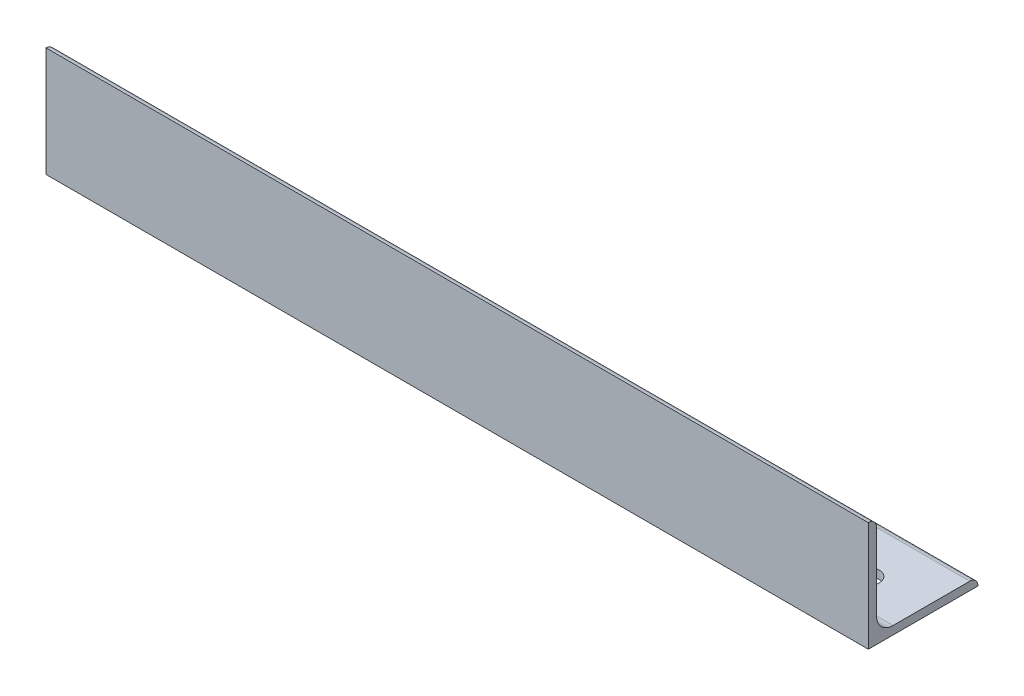
ISO-10303-21;
HEADER;
FILE_DESCRIPTION(('STEP AP214'),'2;1');
FILE_NAME('part.step','',(''),(''),'','','');
FILE_SCHEMA(('AUTOMOTIVE_DESIGN { 1 0 10303 214 1 1 1 1 }'));
ENDSEC;
DATA;
#1=APPLICATION_CONTEXT('core data for automotive mechanical design processes');
#2=APPLICATION_PROTOCOL_DEFINITION('international standard','automotive_design',2000,#1);
#3=PRODUCT_CONTEXT('',#1,'mechanical');
#4=PRODUCT('Part','Part','',(#3));
#5=PRODUCT_RELATED_PRODUCT_CATEGORY('part','',(#4));
#6=PRODUCT_DEFINITION_FORMATION('','',#4);
#7=PRODUCT_DEFINITION_CONTEXT('part definition',#1,'design');
#8=PRODUCT_DEFINITION('design','',#6,#7);
#9=PRODUCT_DEFINITION_SHAPE('','',#8);
#10=(LENGTH_UNIT() NAMED_UNIT(*) SI_UNIT(.MILLI.,.METRE.));
#11=(NAMED_UNIT(*) PLANE_ANGLE_UNIT() SI_UNIT($,.RADIAN.));
#12=(NAMED_UNIT(*) SI_UNIT($,.STERADIAN.) SOLID_ANGLE_UNIT());
#13=UNCERTAINTY_MEASURE_WITH_UNIT(LENGTH_MEASURE(1.E-05),#10,'distance_accuracy_value','');
#14=(GEOMETRIC_REPRESENTATION_CONTEXT(3) GLOBAL_UNCERTAINTY_ASSIGNED_CONTEXT((#13)) GLOBAL_UNIT_ASSIGNED_CONTEXT((#10,
#11,#12)) REPRESENTATION_CONTEXT('',''));
#15=CARTESIAN_POINT('',(0.,0.,0.));
#16=DIRECTION('',(0.,0.,1.));
#17=DIRECTION('',(1.,0.,0.));
#18=AXIS2_PLACEMENT_3D('',#15,#16,#17);
#19=CARTESIAN_POINT('',(300.,0.,-40.));
#20=DIRECTION('',(0.,1.,0.));
#21=DIRECTION('',(0.,0.,1.));
#22=AXIS2_PLACEMENT_3D('',#19,#20,#21);
#23=PLANE('',#22);
#24=CARTESIAN_POINT('',(280.,0.,-20.));
#25=DIRECTION('',(0.,-1.,0.));
#26=DIRECTION('',(0.,0.,-1.));
#27=AXIS2_PLACEMENT_3D('',#24,#25,#26);
#28=CIRCLE('',#27,3.99999999999999);
#29=CARTESIAN_POINT('',(280.,0.,-24.));
#30=VERTEX_POINT('',#29);
#31=EDGE_CURVE('E196',#30,#30,#28,.T.);
#32=ORIENTED_EDGE('',*,*,#31,.F.);
#33=EDGE_LOOP('',(#32));
#34=FACE_BOUND('',#33,.T.);
#35=CARTESIAN_POINT('',(20.,0.,-20.));
#36=DIRECTION('',(0.,-1.,0.));
#37=DIRECTION('',(0.,0.,-1.));
#38=AXIS2_PLACEMENT_3D('',#35,#36,#37);
#39=CIRCLE('',#38,4.);
#40=CARTESIAN_POINT('',(20.,0.,-24.));
#41=VERTEX_POINT('',#40);
#42=EDGE_CURVE('E203',#41,#41,#39,.T.);
#43=ORIENTED_EDGE('',*,*,#42,.F.);
#44=EDGE_LOOP('',(#43));
#45=FACE_BOUND('',#44,.T.);
#46=DIRECTION('',(0.,0.,-1.));
#47=VECTOR('',#46,1.);
#48=CARTESIAN_POINT('',(0.,0.,-40.));
#49=LINE('',#48,#47);
#50=CARTESIAN_POINT('',(0.,0.,0.));
#51=VERTEX_POINT('',#50);
#52=CARTESIAN_POINT('',(0.,0.,-40.));
#53=VERTEX_POINT('',#52);
#54=EDGE_CURVE('E161',#51,#53,#49,.T.);
#55=ORIENTED_EDGE('',*,*,#54,.T.);
#56=DIRECTION('',(-1.,0.,0.));
#57=VECTOR('',#56,1.);
#58=CARTESIAN_POINT('',(300.,0.,-40.));
#59=LINE('',#58,#57);
#60=CARTESIAN_POINT('',(300.,0.,-40.));
#61=VERTEX_POINT('',#60);
#62=EDGE_CURVE('E13',#61,#53,#59,.T.);
#63=ORIENTED_EDGE('',*,*,#62,.F.);
#64=DIRECTION('',(0.,0.,-1.));
#65=VECTOR('',#64,1.);
#66=CARTESIAN_POINT('',(300.,0.,-40.));
#67=LINE('',#66,#65);
#68=CARTESIAN_POINT('',(300.,0.,0.));
#69=VERTEX_POINT('',#68);
#70=EDGE_CURVE('E180',#69,#61,#67,.T.);
#71=ORIENTED_EDGE('',*,*,#70,.F.);
#72=DIRECTION('',(-1.,0.,0.));
#73=VECTOR('',#72,1.);
#74=CARTESIAN_POINT('',(300.,0.,0.));
#75=LINE('',#74,#73);
#76=EDGE_CURVE('E157',#69,#51,#75,.T.);
#77=ORIENTED_EDGE('',*,*,#76,.T.);
#78=EDGE_LOOP('',(#55,#63,#71,#77));
#79=FACE_BOUND('',#78,.T.);
#80=ADVANCED_FACE('F64',(#34,#45,#79),#23,.F.);
#81=CARTESIAN_POINT('',(300.,0.,-37.));
#82=DIRECTION('',(-1.,0.,0.));
#83=DIRECTION('',(0.,0.,1.));
#84=AXIS2_PLACEMENT_3D('',#81,#82,#83);
#85=CYLINDRICAL_SURFACE('',#84,3.);
#86=CARTESIAN_POINT('',(0.,0.,-37.));
#87=DIRECTION('',(1.,0.,0.));
#88=DIRECTION('',(0.,0.,-1.));
#89=AXIS2_PLACEMENT_3D('',#86,#87,#88);
#90=CIRCLE('',#89,3.);
#91=CARTESIAN_POINT('',(0.,3.,-37.));
#92=VERTEX_POINT('',#91);
#93=EDGE_CURVE('E165',#53,#92,#90,.T.);
#94=ORIENTED_EDGE('',*,*,#93,.T.);
#95=DIRECTION('',(-1.,0.,0.));
#96=VECTOR('',#95,1.);
#97=CARTESIAN_POINT('',(300.,3.,-37.));
#98=LINE('',#97,#96);
#99=CARTESIAN_POINT('',(300.,3.,-37.));
#100=VERTEX_POINT('',#99);
#101=EDGE_CURVE('E74',#100,#92,#98,.T.);
#102=ORIENTED_EDGE('',*,*,#101,.F.);
#103=CARTESIAN_POINT('',(300.,0.,-37.));
#104=DIRECTION('',(1.,0.,0.));
#105=DIRECTION('',(0.,0.,-1.));
#106=AXIS2_PLACEMENT_3D('',#103,#104,#105);
#107=CIRCLE('',#106,3.);
#108=EDGE_CURVE('E123',#61,#100,#107,.T.);
#109=ORIENTED_EDGE('',*,*,#108,.F.);
#110=ORIENTED_EDGE('',*,*,#62,.T.);
#111=EDGE_LOOP('',(#94,#102,#109,#110));
#112=FACE_BOUND('',#111,.T.);
#113=ADVANCED_FACE('F243',(#112),#85,.T.);
#114=CARTESIAN_POINT('',(300.,3.,-9.));
#115=DIRECTION('',(0.,-1.,0.));
#116=DIRECTION('',(0.,0.,-1.));
#117=AXIS2_PLACEMENT_3D('',#114,#115,#116);
#118=PLANE('',#117);
#119=CARTESIAN_POINT('',(280.,3.,-20.));
#120=DIRECTION('',(0.,-1.,0.));
#121=DIRECTION('',(0.,0.,-1.));
#122=AXIS2_PLACEMENT_3D('',#119,#120,#121);
#123=CIRCLE('',#122,3.99999999999999);
#124=CARTESIAN_POINT('',(280.,3.,-24.));
#125=VERTEX_POINT('',#124);
#126=EDGE_CURVE('E67',#125,#125,#123,.T.);
#127=ORIENTED_EDGE('',*,*,#126,.T.);
#128=EDGE_LOOP('',(#127));
#129=FACE_BOUND('',#128,.T.);
#130=CARTESIAN_POINT('',(20.,3.,-20.));
#131=DIRECTION('',(0.,-1.,0.));
#132=DIRECTION('',(0.,0.,-1.));
#133=AXIS2_PLACEMENT_3D('',#130,#131,#132);
#134=CIRCLE('',#133,4.);
#135=CARTESIAN_POINT('',(20.,3.,-24.));
#136=VERTEX_POINT('',#135);
#137=EDGE_CURVE('E193',#136,#136,#134,.T.);
#138=ORIENTED_EDGE('',*,*,#137,.T.);
#139=EDGE_LOOP('',(#138));
#140=FACE_BOUND('',#139,.T.);
#141=DIRECTION('',(0.,0.,1.));
#142=VECTOR('',#141,1.);
#143=CARTESIAN_POINT('',(0.,3.,-9.));
#144=LINE('',#143,#142);
#145=CARTESIAN_POINT('',(0.,3.,-9.00000000000001));
#146=VERTEX_POINT('',#145);
#147=EDGE_CURVE('E168',#92,#146,#144,.T.);
#148=ORIENTED_EDGE('',*,*,#147,.T.);
#149=DIRECTION('',(-1.,0.,0.));
#150=VECTOR('',#149,1.);
#151=CARTESIAN_POINT('',(300.,3.,-9.00000000000001));
#152=LINE('',#151,#150);
#153=CARTESIAN_POINT('',(300.,3.,-9.00000000000001));
#154=VERTEX_POINT('',#153);
#155=EDGE_CURVE('E187',#154,#146,#152,.T.);
#156=ORIENTED_EDGE('',*,*,#155,.F.);
#157=DIRECTION('',(0.,0.,1.));
#158=VECTOR('',#157,1.);
#159=CARTESIAN_POINT('',(300.,3.,-9.));
#160=LINE('',#159,#158);
#161=EDGE_CURVE('E215',#100,#154,#160,.T.);
#162=ORIENTED_EDGE('',*,*,#161,.F.);
#163=ORIENTED_EDGE('',*,*,#101,.T.);
#164=EDGE_LOOP('',(#148,#156,#162,#163));
#165=FACE_BOUND('',#164,.T.);
#166=ADVANCED_FACE('F221',(#129,#140,#165),#118,.F.);
#167=CARTESIAN_POINT('',(300.,9.,-9.));
#168=DIRECTION('',(-1.,0.,0.));
#169=DIRECTION('',(0.,0.,1.));
#170=AXIS2_PLACEMENT_3D('',#167,#168,#169);
#171=CYLINDRICAL_SURFACE('',#170,6.);
#172=CARTESIAN_POINT('',(0.,9.,-9.));
#173=DIRECTION('',(-1.,0.,0.));
#174=DIRECTION('',(0.,0.,1.));
#175=AXIS2_PLACEMENT_3D('',#172,#173,#174);
#176=CIRCLE('',#175,6.);
#177=CARTESIAN_POINT('',(0.,9.,-3.));
#178=VERTEX_POINT('',#177);
#179=EDGE_CURVE('E171',#146,#178,#176,.T.);
#180=ORIENTED_EDGE('',*,*,#179,.T.);
#181=DIRECTION('',(-1.,0.,0.));
#182=VECTOR('',#181,1.);
#183=CARTESIAN_POINT('',(300.,9.,-3.));
#184=LINE('',#183,#182);
#185=CARTESIAN_POINT('',(300.,9.,-3.));
#186=VERTEX_POINT('',#185);
#187=EDGE_CURVE('E150',#186,#178,#184,.T.);
#188=ORIENTED_EDGE('',*,*,#187,.F.);
#189=CARTESIAN_POINT('',(300.,9.,-9.));
#190=DIRECTION('',(-1.,0.,0.));
#191=DIRECTION('',(0.,0.,1.));
#192=AXIS2_PLACEMENT_3D('',#189,#190,#191);
#193=CIRCLE('',#192,6.);
#194=EDGE_CURVE('E139',#154,#186,#193,.T.);
#195=ORIENTED_EDGE('',*,*,#194,.F.);
#196=ORIENTED_EDGE('',*,*,#155,.T.);
#197=EDGE_LOOP('',(#180,#188,#195,#196));
#198=FACE_BOUND('',#197,.T.);
#199=ADVANCED_FACE('F225',(#198),#171,.F.);
#200=CARTESIAN_POINT('',(300.,37.,-3.));
#201=DIRECTION('',(0.,0.,1.));
#202=DIRECTION('',(1.,0.,0.));
#203=AXIS2_PLACEMENT_3D('',#200,#201,#202);
#204=PLANE('',#203);
#205=DIRECTION('',(0.,1.,0.));
#206=VECTOR('',#205,1.);
#207=CARTESIAN_POINT('',(0.,37.,-3.));
#208=LINE('',#207,#206);
#209=CARTESIAN_POINT('',(0.,37.,-3.));
#210=VERTEX_POINT('',#209);
#211=EDGE_CURVE('E148',#178,#210,#208,.T.);
#212=ORIENTED_EDGE('',*,*,#211,.T.);
#213=DIRECTION('',(-1.,0.,0.));
#214=VECTOR('',#213,1.);
#215=CARTESIAN_POINT('',(300.,37.,-3.));
#216=LINE('',#215,#214);
#217=CARTESIAN_POINT('',(300.,37.,-3.));
#218=VERTEX_POINT('',#217);
#219=EDGE_CURVE('E145',#218,#210,#216,.T.);
#220=ORIENTED_EDGE('',*,*,#219,.F.);
#221=DIRECTION('',(0.,1.,0.));
#222=VECTOR('',#221,1.);
#223=CARTESIAN_POINT('',(300.,37.,-3.));
#224=LINE('',#223,#222);
#225=EDGE_CURVE('E133',#186,#218,#224,.T.);
#226=ORIENTED_EDGE('',*,*,#225,.F.);
#227=ORIENTED_EDGE('',*,*,#187,.T.);
#228=EDGE_LOOP('',(#212,#220,#226,#227));
#229=FACE_BOUND('',#228,.T.);
#230=ADVANCED_FACE('F146',(#229),#204,.F.);
#231=CARTESIAN_POINT('',(300.,37.,0.));
#232=DIRECTION('',(-1.,0.,0.));
#233=DIRECTION('',(0.,0.,1.));
#234=AXIS2_PLACEMENT_3D('',#231,#232,#233);
#235=CYLINDRICAL_SURFACE('',#234,3.);
#236=CARTESIAN_POINT('',(0.,37.,0.));
#237=DIRECTION('',(1.,0.,0.));
#238=DIRECTION('',(0.,0.,-1.));
#239=AXIS2_PLACEMENT_3D('',#236,#237,#238);
#240=CIRCLE('',#239,3.);
#241=CARTESIAN_POINT('',(0.,40.,0.));
#242=VERTEX_POINT('',#241);
#243=EDGE_CURVE('E109',#210,#242,#240,.T.);
#244=ORIENTED_EDGE('',*,*,#243,.T.);
#245=DIRECTION('',(-1.,0.,0.));
#246=VECTOR('',#245,1.);
#247=CARTESIAN_POINT('',(300.,40.,0.));
#248=LINE('',#247,#246);
#249=CARTESIAN_POINT('',(300.,40.,0.));
#250=VERTEX_POINT('',#249);
#251=EDGE_CURVE('E151',#250,#242,#248,.T.);
#252=ORIENTED_EDGE('',*,*,#251,.F.);
#253=CARTESIAN_POINT('',(300.,37.,0.));
#254=DIRECTION('',(1.,0.,0.));
#255=DIRECTION('',(0.,0.,-1.));
#256=AXIS2_PLACEMENT_3D('',#253,#254,#255);
#257=CIRCLE('',#256,3.);
#258=EDGE_CURVE('E137',#218,#250,#257,.T.);
#259=ORIENTED_EDGE('',*,*,#258,.F.);
#260=ORIENTED_EDGE('',*,*,#219,.T.);
#261=EDGE_LOOP('',(#244,#252,#259,#260));
#262=FACE_BOUND('',#261,.T.);
#263=ADVANCED_FACE('F153',(#262),#235,.T.);
#264=CARTESIAN_POINT('',(300.,40.,0.));
#265=DIRECTION('',(0.,0.,-1.));
#266=DIRECTION('',(-1.,0.,0.));
#267=AXIS2_PLACEMENT_3D('',#264,#265,#266);
#268=PLANE('',#267);
#269=DIRECTION('',(0.,-1.,0.));
#270=VECTOR('',#269,1.);
#271=CARTESIAN_POINT('',(0.,40.,0.));
#272=LINE('',#271,#270);
#273=EDGE_CURVE('E115',#242,#51,#272,.T.);
#274=ORIENTED_EDGE('',*,*,#273,.T.);
#275=ORIENTED_EDGE('',*,*,#76,.F.);
#276=DIRECTION('',(0.,-1.,0.));
#277=VECTOR('',#276,1.);
#278=CARTESIAN_POINT('',(300.,40.,0.));
#279=LINE('',#278,#277);
#280=EDGE_CURVE('E83',#250,#69,#279,.T.);
#281=ORIENTED_EDGE('',*,*,#280,.F.);
#282=ORIENTED_EDGE('',*,*,#251,.T.);
#283=EDGE_LOOP('',(#274,#275,#281,#282));
#284=FACE_BOUND('',#283,.T.);
#285=ADVANCED_FACE('F232',(#284),#268,.F.);
#286=CARTESIAN_POINT('',(300.,37.,0.));
#287=DIRECTION('',(1.,0.,0.));
#288=DIRECTION('',(0.,0.,-1.));
#289=AXIS2_PLACEMENT_3D('',#286,#287,#288);
#290=PLANE('',#289);
#291=ORIENTED_EDGE('',*,*,#70,.T.);
#292=ORIENTED_EDGE('',*,*,#108,.T.);
#293=ORIENTED_EDGE('',*,*,#161,.T.);
#294=ORIENTED_EDGE('',*,*,#194,.T.);
#295=ORIENTED_EDGE('',*,*,#225,.T.);
#296=ORIENTED_EDGE('',*,*,#258,.T.);
#297=ORIENTED_EDGE('',*,*,#280,.T.);
#298=EDGE_LOOP('',(#291,#292,#293,#294,#295,#296,#297));
#299=FACE_BOUND('',#298,.T.);
#300=ADVANCED_FACE('F135',(#299),#290,.T.);
#301=CARTESIAN_POINT('',(0.,37.,0.));
#302=DIRECTION('',(1.,0.,0.));
#303=DIRECTION('',(0.,0.,-1.));
#304=AXIS2_PLACEMENT_3D('',#301,#302,#303);
#305=PLANE('',#304);
#306=ORIENTED_EDGE('',*,*,#54,.F.);
#307=ORIENTED_EDGE('',*,*,#273,.F.);
#308=ORIENTED_EDGE('',*,*,#243,.F.);
#309=ORIENTED_EDGE('',*,*,#211,.F.);
#310=ORIENTED_EDGE('',*,*,#179,.F.);
#311=ORIENTED_EDGE('',*,*,#147,.F.);
#312=ORIENTED_EDGE('',*,*,#93,.F.);
#313=EDGE_LOOP('',(#306,#307,#308,#309,#310,#311,#312));
#314=FACE_BOUND('',#313,.T.);
#315=ADVANCED_FACE('F228',(#314),#305,.F.);
#316=CARTESIAN_POINT('',(20.,10.,-20.));
#317=DIRECTION('',(0.,-1.,0.));
#318=DIRECTION('',(0.,0.,-1.));
#319=AXIS2_PLACEMENT_3D('',#316,#317,#318);
#320=CYLINDRICAL_SURFACE('',#319,4.);
#321=ORIENTED_EDGE('',*,*,#42,.T.);
#322=EDGE_LOOP('',(#321));
#323=FACE_BOUND('',#322,.T.);
#324=ORIENTED_EDGE('',*,*,#137,.F.);
#325=EDGE_LOOP('',(#324));
#326=FACE_BOUND('',#325,.T.);
#327=ADVANCED_FACE('F253',(#323,#326),#320,.F.);
#328=CARTESIAN_POINT('',(280.,10.,-20.));
#329=DIRECTION('',(0.,-1.,0.));
#330=DIRECTION('',(0.,0.,-1.));
#331=AXIS2_PLACEMENT_3D('',#328,#329,#330);
#332=CYLINDRICAL_SURFACE('',#331,3.99999999999999);
#333=ORIENTED_EDGE('',*,*,#31,.T.);
#334=EDGE_LOOP('',(#333));
#335=FACE_BOUND('',#334,.T.);
#336=ORIENTED_EDGE('',*,*,#126,.F.);
#337=EDGE_LOOP('',(#336));
#338=FACE_BOUND('',#337,.T.);
#339=ADVANCED_FACE('F256',(#335,#338),#332,.F.);
#340=CLOSED_SHELL('',(#80,#113,#166,#199,#230,#263,#285,#300,#315,#327,#339));
#341=MANIFOLD_SOLID_BREP('B2',#340);
#342=ADVANCED_BREP_SHAPE_REPRESENTATION('',(#18,#341),#14);
#343=SHAPE_DEFINITION_REPRESENTATION(#9,#342);
ENDSEC;
END-ISO-10303-21;
